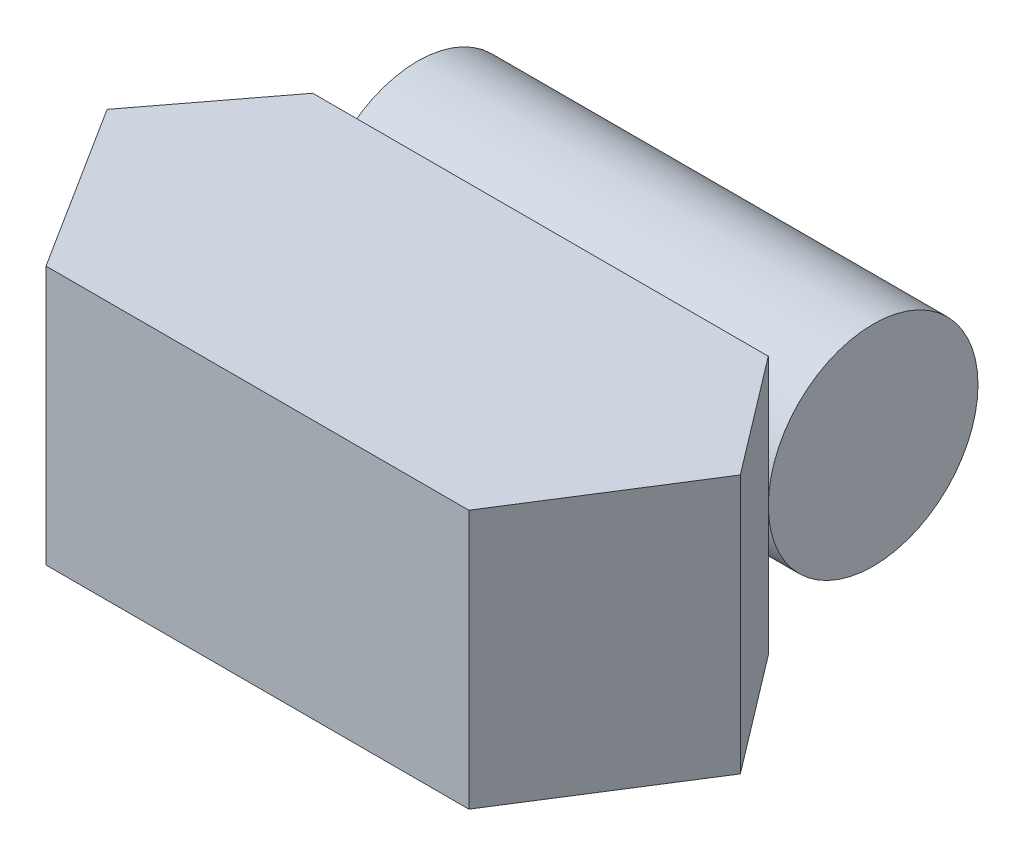
ISO-10303-21;
HEADER;
FILE_DESCRIPTION(('STEP AP214'),'2;1');
FILE_NAME('part.step','',(''),(''),'','','');
FILE_SCHEMA(('AUTOMOTIVE_DESIGN { 1 0 10303 214 1 1 1 1 }'));
ENDSEC;
DATA;
#1=APPLICATION_CONTEXT('core data for automotive mechanical design processes');
#2=APPLICATION_PROTOCOL_DEFINITION('international standard','automotive_design',2000,#1);
#3=PRODUCT_CONTEXT('',#1,'mechanical');
#4=PRODUCT('Part','Part','',(#3));
#5=PRODUCT_RELATED_PRODUCT_CATEGORY('part','',(#4));
#6=PRODUCT_DEFINITION_FORMATION('','',#4);
#7=PRODUCT_DEFINITION_CONTEXT('part definition',#1,'design');
#8=PRODUCT_DEFINITION('design','',#6,#7);
#9=PRODUCT_DEFINITION_SHAPE('','',#8);
#10=(LENGTH_UNIT() NAMED_UNIT(*) SI_UNIT(.MILLI.,.METRE.));
#11=(NAMED_UNIT(*) PLANE_ANGLE_UNIT() SI_UNIT($,.RADIAN.));
#12=(NAMED_UNIT(*) SI_UNIT($,.STERADIAN.) SOLID_ANGLE_UNIT());
#13=UNCERTAINTY_MEASURE_WITH_UNIT(LENGTH_MEASURE(1.E-05),#10,'distance_accuracy_value','');
#14=(GEOMETRIC_REPRESENTATION_CONTEXT(3) GLOBAL_UNCERTAINTY_ASSIGNED_CONTEXT((#13)) GLOBAL_UNIT_ASSIGNED_CONTEXT((#10,
#11,#12)) REPRESENTATION_CONTEXT('',''));
#15=CARTESIAN_POINT('',(0.,0.,0.));
#16=DIRECTION('',(0.,0.,1.));
#17=DIRECTION('',(1.,0.,0.));
#18=AXIS2_PLACEMENT_3D('',#15,#16,#17);
#19=CARTESIAN_POINT('',(13.1977695055697,7.5,-6.075));
#20=DIRECTION('',(-1.,0.,0.));
#21=DIRECTION('',(0.,0.,1.));
#22=AXIS2_PLACEMENT_3D('',#19,#20,#21);
#23=CYLINDRICAL_SURFACE('',#22,6.075);
#24=CARTESIAN_POINT('',(13.1977695055697,7.5,-6.075));
#25=DIRECTION('',(1.,0.,0.));
#26=DIRECTION('',(0.,0.,-1.));
#27=AXIS2_PLACEMENT_3D('',#24,#25,#26);
#28=CIRCLE('',#27,6.075);
#29=CARTESIAN_POINT('',(13.1977695055697,7.5,-12.15));
#30=VERTEX_POINT('',#29);
#31=EDGE_CURVE('E11',#30,#30,#28,.T.);
#32=ORIENTED_EDGE('',*,*,#31,.F.);
#33=EDGE_LOOP('',(#32));
#34=FACE_BOUND('',#33,.T.);
#35=CARTESIAN_POINT('',(-13.1977695055697,7.5,-6.075));
#36=DIRECTION('',(1.,0.,0.));
#37=DIRECTION('',(0.,0.,-1.));
#38=AXIS2_PLACEMENT_3D('',#35,#36,#37);
#39=CIRCLE('',#38,6.075);
#40=CARTESIAN_POINT('',(-13.1977695055697,7.5,-12.15));
#41=VERTEX_POINT('',#40);
#42=EDGE_CURVE('E62',#41,#41,#39,.T.);
#43=ORIENTED_EDGE('',*,*,#42,.T.);
#44=EDGE_LOOP('',(#43));
#45=FACE_BOUND('',#44,.T.);
#46=ADVANCED_FACE('F55',(#34,#45),#23,.T.);
#47=CARTESIAN_POINT('',(13.1977695055697,7.5,-6.075));
#48=DIRECTION('',(1.,0.,0.));
#49=DIRECTION('',(0.,0.,-1.));
#50=AXIS2_PLACEMENT_3D('',#47,#48,#49);
#51=PLANE('',#50);
#52=ORIENTED_EDGE('',*,*,#31,.T.);
#53=EDGE_LOOP('',(#52));
#54=FACE_BOUND('',#53,.T.);
#55=ADVANCED_FACE('F71',(#54),#51,.T.);
#56=CARTESIAN_POINT('',(-13.1977695055697,7.5,-6.075));
#57=DIRECTION('',(1.,0.,0.));
#58=DIRECTION('',(0.,0.,-1.));
#59=AXIS2_PLACEMENT_3D('',#56,#57,#58);
#60=PLANE('',#59);
#61=ORIENTED_EDGE('',*,*,#42,.F.);
#62=EDGE_LOOP('',(#61));
#63=FACE_BOUND('',#62,.T.);
#64=ADVANCED_FACE('F69',(#63),#60,.F.);
#65=CLOSED_SHELL('',(#46,#55,#64));
#66=MANIFOLD_SOLID_BREP('B2',#65);
#67=CARTESIAN_POINT('',(-13.1977695055697,15.,0.));
#68=DIRECTION('',(0.,0.,1.));
#69=DIRECTION('',(1.,0.,0.));
#70=AXIS2_PLACEMENT_3D('',#67,#68,#69);
#71=PLANE('',#70);
#72=DIRECTION('',(-1.,0.,0.));
#73=VECTOR('',#72,1.);
#74=CARTESIAN_POINT('',(-13.1977695055697,0.,0.));
#75=LINE('',#74,#73);
#76=CARTESIAN_POINT('',(13.1977695055697,0.,0.));
#77=VERTEX_POINT('',#76);
#78=CARTESIAN_POINT('',(-13.1977695055697,0.,0.));
#79=VERTEX_POINT('',#78);
#80=EDGE_CURVE('E192',#77,#79,#75,.T.);
#81=ORIENTED_EDGE('',*,*,#80,.T.);
#82=DIRECTION('',(0.,-1.,0.));
#83=VECTOR('',#82,1.);
#84=CARTESIAN_POINT('',(-13.1977695055697,15.,0.));
#85=LINE('',#84,#83);
#86=CARTESIAN_POINT('',(-13.1977695055697,15.,0.));
#87=VERTEX_POINT('',#86);
#88=EDGE_CURVE('E53',#87,#79,#85,.T.);
#89=ORIENTED_EDGE('',*,*,#88,.F.);
#90=DIRECTION('',(-1.,0.,0.));
#91=VECTOR('',#90,1.);
#92=CARTESIAN_POINT('',(-13.1977695055697,15.,0.));
#93=LINE('',#92,#91);
#94=CARTESIAN_POINT('',(13.1977695055697,15.,0.));
#95=VERTEX_POINT('',#94);
#96=EDGE_CURVE('E208',#95,#87,#93,.T.);
#97=ORIENTED_EDGE('',*,*,#96,.F.);
#98=DIRECTION('',(0.,-1.,0.));
#99=VECTOR('',#98,1.);
#100=CARTESIAN_POINT('',(13.1977695055697,15.,0.));
#101=LINE('',#100,#99);
#102=EDGE_CURVE('E150',#95,#77,#101,.T.);
#103=ORIENTED_EDGE('',*,*,#102,.T.);
#104=EDGE_LOOP('',(#81,#89,#97,#103));
#105=FACE_BOUND('',#104,.T.);
#106=ADVANCED_FACE('F104',(#105),#71,.F.);
#107=CARTESIAN_POINT('',(-13.1977695055697,15.,0.));
#108=DIRECTION('',(0.795920181421374,0.,0.60540157317781));
#109=DIRECTION('',(0.60540157317781,0.,-0.795920181421374));
#110=AXIS2_PLACEMENT_3D('',#107,#108,#109);
#111=PLANE('',#110);
#112=DIRECTION('',(-0.60540157317781,0.,0.795920181421374));
#113=VECTOR('',#112,1.);
#114=CARTESIAN_POINT('',(-13.1977695055697,0.,0.));
#115=LINE('',#114,#113);
#116=CARTESIAN_POINT('',(-18.3436828775811,0.,6.76532154208168));
#117=VERTEX_POINT('',#116);
#118=EDGE_CURVE('E195',#79,#117,#115,.T.);
#119=ORIENTED_EDGE('',*,*,#118,.T.);
#120=DIRECTION('',(0.,-1.,0.));
#121=VECTOR('',#120,1.);
#122=CARTESIAN_POINT('',(-18.3436828775811,15.,6.76532154208168));
#123=LINE('',#122,#121);
#124=CARTESIAN_POINT('',(-18.3436828775811,15.,6.76532154208168));
#125=VERTEX_POINT('',#124);
#126=EDGE_CURVE('E113',#125,#117,#123,.T.);
#127=ORIENTED_EDGE('',*,*,#126,.F.);
#128=DIRECTION('',(-0.60540157317781,0.,0.795920181421374));
#129=VECTOR('',#128,1.);
#130=CARTESIAN_POINT('',(-13.1977695055697,15.,0.));
#131=LINE('',#130,#129);
#132=EDGE_CURVE('E158',#87,#125,#131,.T.);
#133=ORIENTED_EDGE('',*,*,#132,.F.);
#134=ORIENTED_EDGE('',*,*,#88,.T.);
#135=EDGE_LOOP('',(#119,#127,#133,#134));
#136=FACE_BOUND('',#135,.T.);
#137=ADVANCED_FACE('F232',(#136),#111,.F.);
#138=CARTESIAN_POINT('',(-18.3436828775811,15.,6.76532154208168));
#139=DIRECTION('',(0.84514723315073,0.,-0.534533585752725));
#140=DIRECTION('',(-0.534533585752725,0.,-0.84514723315073));
#141=AXIS2_PLACEMENT_3D('',#138,#139,#140);
#142=PLANE('',#141);
#143=DIRECTION('',(0.534533585752725,0.,0.84514723315073));
#144=VECTOR('',#143,1.);
#145=CARTESIAN_POINT('',(-18.3436828775811,0.,6.76532154208168));
#146=LINE('',#145,#144);
#147=CARTESIAN_POINT('',(-12.25,0.,16.4));
#148=VERTEX_POINT('',#147);
#149=EDGE_CURVE('E198',#117,#148,#146,.T.);
#150=ORIENTED_EDGE('',*,*,#149,.T.);
#151=DIRECTION('',(0.,-1.,0.));
#152=VECTOR('',#151,1.);
#153=CARTESIAN_POINT('',(-12.25,15.,16.4));
#154=LINE('',#153,#152);
#155=CARTESIAN_POINT('',(-12.25,15.,16.4));
#156=VERTEX_POINT('',#155);
#157=EDGE_CURVE('E182',#156,#148,#154,.T.);
#158=ORIENTED_EDGE('',*,*,#157,.F.);
#159=DIRECTION('',(0.534533585752725,0.,0.84514723315073));
#160=VECTOR('',#159,1.);
#161=CARTESIAN_POINT('',(-18.3436828775811,15.,6.76532154208168));
#162=LINE('',#161,#160);
#163=EDGE_CURVE('E171',#125,#156,#162,.T.);
#164=ORIENTED_EDGE('',*,*,#163,.F.);
#165=ORIENTED_EDGE('',*,*,#126,.T.);
#166=EDGE_LOOP('',(#150,#158,#164,#165));
#167=FACE_BOUND('',#166,.T.);
#168=ADVANCED_FACE('F218',(#167),#142,.F.);
#169=CARTESIAN_POINT('',(-12.25,15.,16.4));
#170=DIRECTION('',(0.,0.,-1.));
#171=DIRECTION('',(-1.,0.,0.));
#172=AXIS2_PLACEMENT_3D('',#169,#170,#171);
#173=PLANE('',#172);
#174=DIRECTION('',(1.,0.,0.));
#175=VECTOR('',#174,1.);
#176=CARTESIAN_POINT('',(-12.25,0.,16.4));
#177=LINE('',#176,#175);
#178=CARTESIAN_POINT('',(12.25,0.,16.4));
#179=VERTEX_POINT('',#178);
#180=EDGE_CURVE('E180',#148,#179,#177,.T.);
#181=ORIENTED_EDGE('',*,*,#180,.T.);
#182=DIRECTION('',(0.,-1.,0.));
#183=VECTOR('',#182,1.);
#184=CARTESIAN_POINT('',(12.25,15.,16.4));
#185=LINE('',#184,#183);
#186=CARTESIAN_POINT('',(12.25,15.,16.4));
#187=VERTEX_POINT('',#186);
#188=EDGE_CURVE('E177',#187,#179,#185,.T.);
#189=ORIENTED_EDGE('',*,*,#188,.F.);
#190=DIRECTION('',(1.,0.,0.));
#191=VECTOR('',#190,1.);
#192=CARTESIAN_POINT('',(-12.25,15.,16.4));
#193=LINE('',#192,#191);
#194=EDGE_CURVE('E165',#156,#187,#193,.T.);
#195=ORIENTED_EDGE('',*,*,#194,.F.);
#196=ORIENTED_EDGE('',*,*,#157,.T.);
#197=EDGE_LOOP('',(#181,#189,#195,#196));
#198=FACE_BOUND('',#197,.T.);
#199=ADVANCED_FACE('F178',(#198),#173,.F.);
#200=CARTESIAN_POINT('',(18.3436828775811,15.,6.76532154208168));
#201=DIRECTION('',(-0.84514723315073,0.,-0.534533585752725));
#202=DIRECTION('',(-0.534533585752725,0.,0.84514723315073));
#203=AXIS2_PLACEMENT_3D('',#200,#201,#202);
#204=PLANE('',#203);
#205=DIRECTION('',(0.534533585752725,0.,-0.84514723315073));
#206=VECTOR('',#205,1.);
#207=CARTESIAN_POINT('',(18.3436828775811,0.,6.76532154208168));
#208=LINE('',#207,#206);
#209=CARTESIAN_POINT('',(18.3436828775811,0.,6.76532154208168));
#210=VERTEX_POINT('',#209);
#211=EDGE_CURVE('E143',#179,#210,#208,.T.);
#212=ORIENTED_EDGE('',*,*,#211,.T.);
#213=DIRECTION('',(0.,-1.,0.));
#214=VECTOR('',#213,1.);
#215=CARTESIAN_POINT('',(18.3436828775811,15.,6.76532154208168));
#216=LINE('',#215,#214);
#217=CARTESIAN_POINT('',(18.3436828775811,15.,6.76532154208168));
#218=VERTEX_POINT('',#217);
#219=EDGE_CURVE('E183',#218,#210,#216,.T.);
#220=ORIENTED_EDGE('',*,*,#219,.F.);
#221=DIRECTION('',(0.534533585752725,0.,-0.84514723315073));
#222=VECTOR('',#221,1.);
#223=CARTESIAN_POINT('',(18.3436828775811,15.,6.76532154208168));
#224=LINE('',#223,#222);
#225=EDGE_CURVE('E169',#187,#218,#224,.T.);
#226=ORIENTED_EDGE('',*,*,#225,.F.);
#227=ORIENTED_EDGE('',*,*,#188,.T.);
#228=EDGE_LOOP('',(#212,#220,#226,#227));
#229=FACE_BOUND('',#228,.T.);
#230=ADVANCED_FACE('F185',(#229),#204,.F.);
#231=CARTESIAN_POINT('',(13.1977695055697,15.,0.));
#232=DIRECTION('',(-0.795920181421374,0.,0.60540157317781));
#233=DIRECTION('',(0.60540157317781,0.,0.795920181421374));
#234=AXIS2_PLACEMENT_3D('',#231,#232,#233);
#235=PLANE('',#234);
#236=DIRECTION('',(-0.60540157317781,0.,-0.795920181421374));
#237=VECTOR('',#236,1.);
#238=CARTESIAN_POINT('',(13.1977695055697,0.,0.));
#239=LINE('',#238,#237);
#240=EDGE_CURVE('E205',#210,#77,#239,.T.);
#241=ORIENTED_EDGE('',*,*,#240,.T.);
#242=ORIENTED_EDGE('',*,*,#102,.F.);
#243=DIRECTION('',(-0.60540157317781,0.,-0.795920181421374));
#244=VECTOR('',#243,1.);
#245=CARTESIAN_POINT('',(13.1977695055697,15.,0.));
#246=LINE('',#245,#244);
#247=EDGE_CURVE('E121',#218,#95,#246,.T.);
#248=ORIENTED_EDGE('',*,*,#247,.F.);
#249=ORIENTED_EDGE('',*,*,#219,.T.);
#250=EDGE_LOOP('',(#241,#242,#248,#249));
#251=FACE_BOUND('',#250,.T.);
#252=ADVANCED_FACE('F225',(#251),#235,.F.);
#253=CARTESIAN_POINT('',(0.,15.,0.));
#254=DIRECTION('',(0.,-1.,0.));
#255=DIRECTION('',(0.,0.,-1.));
#256=AXIS2_PLACEMENT_3D('',#253,#254,#255);
#257=PLANE('',#256);
#258=ORIENTED_EDGE('',*,*,#96,.T.);
#259=ORIENTED_EDGE('',*,*,#132,.T.);
#260=ORIENTED_EDGE('',*,*,#163,.T.);
#261=ORIENTED_EDGE('',*,*,#194,.T.);
#262=ORIENTED_EDGE('',*,*,#225,.T.);
#263=ORIENTED_EDGE('',*,*,#247,.T.);
#264=EDGE_LOOP('',(#258,#259,#260,#261,#262,#263));
#265=FACE_BOUND('',#264,.T.);
#266=ADVANCED_FACE('F167',(#265),#257,.F.);
#267=CARTESIAN_POINT('',(0.,0.,0.));
#268=DIRECTION('',(0.,-1.,0.));
#269=DIRECTION('',(0.,0.,-1.));
#270=AXIS2_PLACEMENT_3D('',#267,#268,#269);
#271=PLANE('',#270);
#272=ORIENTED_EDGE('',*,*,#80,.F.);
#273=ORIENTED_EDGE('',*,*,#240,.F.);
#274=ORIENTED_EDGE('',*,*,#211,.F.);
#275=ORIENTED_EDGE('',*,*,#180,.F.);
#276=ORIENTED_EDGE('',*,*,#149,.F.);
#277=ORIENTED_EDGE('',*,*,#118,.F.);
#278=EDGE_LOOP('',(#272,#273,#274,#275,#276,#277));
#279=FACE_BOUND('',#278,.T.);
#280=ADVANCED_FACE('F222',(#279),#271,.T.);
#281=CLOSED_SHELL('',(#106,#137,#168,#199,#230,#252,#266,#280));
#282=MANIFOLD_SOLID_BREP('B6',#281);
#283=ADVANCED_BREP_SHAPE_REPRESENTATION('',(#18,#66,#282),#14);
#284=SHAPE_DEFINITION_REPRESENTATION(#9,#283);
ENDSEC;
END-ISO-10303-21;
